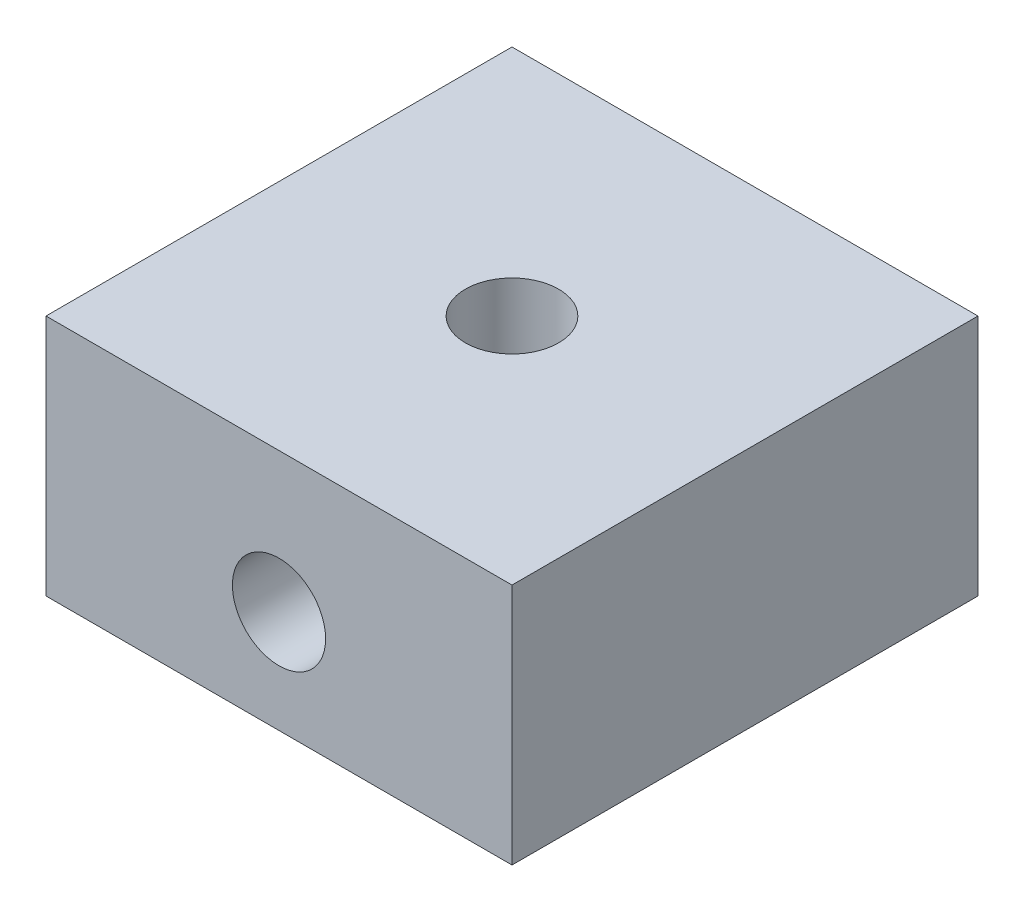
ISO-10303-21;
HEADER;
FILE_DESCRIPTION(('STEP AP214'),'2;1');
FILE_NAME('part.step','',(''),(''),'','','');
FILE_SCHEMA(('AUTOMOTIVE_DESIGN { 1 0 10303 214 1 1 1 1 }'));
ENDSEC;
DATA;
#1=APPLICATION_CONTEXT('core data for automotive mechanical design processes');
#2=APPLICATION_PROTOCOL_DEFINITION('international standard','automotive_design',2000,#1);
#3=PRODUCT_CONTEXT('',#1,'mechanical');
#4=PRODUCT('Part','Part','',(#3));
#5=PRODUCT_RELATED_PRODUCT_CATEGORY('part','',(#4));
#6=PRODUCT_DEFINITION_FORMATION('','',#4);
#7=PRODUCT_DEFINITION_CONTEXT('part definition',#1,'design');
#8=PRODUCT_DEFINITION('design','',#6,#7);
#9=PRODUCT_DEFINITION_SHAPE('','',#8);
#10=(LENGTH_UNIT() NAMED_UNIT(*) SI_UNIT(.MILLI.,.METRE.));
#11=(NAMED_UNIT(*) PLANE_ANGLE_UNIT() SI_UNIT($,.RADIAN.));
#12=(NAMED_UNIT(*) SI_UNIT($,.STERADIAN.) SOLID_ANGLE_UNIT());
#13=UNCERTAINTY_MEASURE_WITH_UNIT(LENGTH_MEASURE(1.E-05),#10,'distance_accuracy_value','');
#14=(GEOMETRIC_REPRESENTATION_CONTEXT(3) GLOBAL_UNCERTAINTY_ASSIGNED_CONTEXT((#13)) GLOBAL_UNIT_ASSIGNED_CONTEXT((#10,
#11,#12)) REPRESENTATION_CONTEXT('',''));
#15=CARTESIAN_POINT('',(0.,0.,0.));
#16=DIRECTION('',(0.,0.,1.));
#17=DIRECTION('',(1.,0.,0.));
#18=AXIS2_PLACEMENT_3D('',#15,#16,#17);
#19=CARTESIAN_POINT('',(0.,10.,0.));
#20=DIRECTION('',(-1.,0.,0.));
#21=DIRECTION('',(0.,1.,0.));
#22=AXIS2_PLACEMENT_3D('',#19,#20,#21);
#23=SPHERICAL_SURFACE('',#22,5.);
#24=CARTESIAN_POINT('',(0.,10.,0.));
#25=DIRECTION('',(0.,1.,0.));
#26=DIRECTION('',(0.,0.,1.));
#27=AXIS2_PLACEMENT_3D('',#24,#25,#26);
#28=CIRCLE('',#27,5.);
#29=CARTESIAN_POINT('',(5.,10.,0.));
#30=VERTEX_POINT('',#29);
#31=CARTESIAN_POINT('',(-5.,10.,0.));
#32=VERTEX_POINT('',#31);
#33=EDGE_CURVE('E87',#30,#32,#28,.T.);
#34=ORIENTED_EDGE('',*,*,#33,.T.);
#35=CARTESIAN_POINT('',(0.,10.,0.));
#36=DIRECTION('',(0.,0.,1.));
#37=DIRECTION('',(1.,0.,0.));
#38=AXIS2_PLACEMENT_3D('',#35,#36,#37);
#39=CIRCLE('',#38,5.);
#40=EDGE_CURVE('E11',#32,#30,#39,.T.);
#41=ORIENTED_EDGE('',*,*,#40,.T.);
#42=EDGE_LOOP('',(#34,#41));
#43=FACE_BOUND('',#42,.T.);
#44=ADVANCED_FACE('F37',(#43),#23,.F.);
#45=CARTESIAN_POINT('',(25.,-1.0186,-25.));
#46=DIRECTION('',(1.,0.,0.));
#47=DIRECTION('',(0.,0.,-1.));
#48=AXIS2_PLACEMENT_3D('',#45,#46,#47);
#49=PLANE('',#48);
#50=DIRECTION('',(0.,1.,0.));
#51=VECTOR('',#50,1.);
#52=CARTESIAN_POINT('',(25.,-1.0186,-25.));
#53=LINE('',#52,#51);
#54=CARTESIAN_POINT('',(25.,-1.0186,-25.));
#55=VERTEX_POINT('',#54);
#56=CARTESIAN_POINT('',(25.,25.,-25.));
#57=VERTEX_POINT('',#56);
#58=EDGE_CURVE('E119',#55,#57,#53,.T.);
#59=ORIENTED_EDGE('',*,*,#58,.T.);
#60=DIRECTION('',(0.,0.,-1.));
#61=VECTOR('',#60,1.);
#62=CARTESIAN_POINT('',(25.,25.,-25.));
#63=LINE('',#62,#61);
#64=CARTESIAN_POINT('',(25.,25.,25.));
#65=VERTEX_POINT('',#64);
#66=EDGE_CURVE('E91',#65,#57,#63,.T.);
#67=ORIENTED_EDGE('',*,*,#66,.F.);
#68=DIRECTION('',(0.,1.,0.));
#69=VECTOR('',#68,1.);
#70=CARTESIAN_POINT('',(25.,-1.0186,25.));
#71=LINE('',#70,#69);
#72=CARTESIAN_POINT('',(25.,-1.0186,25.));
#73=VERTEX_POINT('',#72);
#74=EDGE_CURVE('E45',#73,#65,#71,.T.);
#75=ORIENTED_EDGE('',*,*,#74,.F.);
#76=DIRECTION('',(0.,0.,-1.));
#77=VECTOR('',#76,1.);
#78=CARTESIAN_POINT('',(25.,-1.0186,-25.));
#79=LINE('',#78,#77);
#80=EDGE_CURVE('E108',#73,#55,#79,.T.);
#81=ORIENTED_EDGE('',*,*,#80,.T.);
#82=EDGE_LOOP('',(#59,#67,#75,#81));
#83=FACE_BOUND('',#82,.T.);
#84=ADVANCED_FACE('F39',(#83),#49,.T.);
#85=CARTESIAN_POINT('',(-25.,-1.0186,25.));
#86=DIRECTION('',(0.,0.,1.));
#87=DIRECTION('',(1.,0.,0.));
#88=AXIS2_PLACEMENT_3D('',#85,#86,#87);
#89=PLANE('',#88);
#90=CARTESIAN_POINT('',(0.,10.,25.));
#91=DIRECTION('',(0.,0.,1.));
#92=DIRECTION('',(1.,0.,0.));
#93=AXIS2_PLACEMENT_3D('',#90,#91,#92);
#94=CIRCLE('',#93,5.);
#95=CARTESIAN_POINT('',(5.,10.,25.));
#96=VERTEX_POINT('',#95);
#97=EDGE_CURVE('E89',#96,#96,#94,.T.);
#98=ORIENTED_EDGE('',*,*,#97,.F.);
#99=EDGE_LOOP('',(#98));
#100=FACE_BOUND('',#99,.T.);
#101=ORIENTED_EDGE('',*,*,#74,.T.);
#102=DIRECTION('',(1.,0.,0.));
#103=VECTOR('',#102,1.);
#104=CARTESIAN_POINT('',(-25.,25.,25.));
#105=LINE('',#104,#103);
#106=CARTESIAN_POINT('',(-25.,25.,25.));
#107=VERTEX_POINT('',#106);
#108=EDGE_CURVE('E105',#107,#65,#105,.T.);
#109=ORIENTED_EDGE('',*,*,#108,.F.);
#110=DIRECTION('',(0.,1.,0.));
#111=VECTOR('',#110,1.);
#112=CARTESIAN_POINT('',(-25.,-1.0186,25.));
#113=LINE('',#112,#111);
#114=CARTESIAN_POINT('',(-25.,-1.0186,25.));
#115=VERTEX_POINT('',#114);
#116=EDGE_CURVE('E121',#115,#107,#113,.T.);
#117=ORIENTED_EDGE('',*,*,#116,.F.);
#118=DIRECTION('',(1.,0.,0.));
#119=VECTOR('',#118,1.);
#120=CARTESIAN_POINT('',(-25.,-1.0186,25.));
#121=LINE('',#120,#119);
#122=EDGE_CURVE('E116',#115,#73,#121,.T.);
#123=ORIENTED_EDGE('',*,*,#122,.T.);
#124=EDGE_LOOP('',(#101,#109,#117,#123));
#125=FACE_BOUND('',#124,.T.);
#126=ADVANCED_FACE('F133',(#100,#125),#89,.T.);
#127=CARTESIAN_POINT('',(-25.,-1.0186,-25.));
#128=DIRECTION('',(-1.,0.,0.));
#129=DIRECTION('',(0.,0.,1.));
#130=AXIS2_PLACEMENT_3D('',#127,#128,#129);
#131=PLANE('',#130);
#132=ORIENTED_EDGE('',*,*,#116,.T.);
#133=DIRECTION('',(0.,0.,1.));
#134=VECTOR('',#133,1.);
#135=CARTESIAN_POINT('',(-25.,25.,-25.));
#136=LINE('',#135,#134);
#137=CARTESIAN_POINT('',(-25.,25.,-25.));
#138=VERTEX_POINT('',#137);
#139=EDGE_CURVE('E102',#138,#107,#136,.T.);
#140=ORIENTED_EDGE('',*,*,#139,.F.);
#141=DIRECTION('',(0.,1.,0.));
#142=VECTOR('',#141,1.);
#143=CARTESIAN_POINT('',(-25.,-1.0186,-25.));
#144=LINE('',#143,#142);
#145=CARTESIAN_POINT('',(-25.,-1.0186,-25.));
#146=VERTEX_POINT('',#145);
#147=EDGE_CURVE('E123',#146,#138,#144,.T.);
#148=ORIENTED_EDGE('',*,*,#147,.F.);
#149=DIRECTION('',(0.,0.,1.));
#150=VECTOR('',#149,1.);
#151=CARTESIAN_POINT('',(-25.,-1.0186,-25.));
#152=LINE('',#151,#150);
#153=EDGE_CURVE('E113',#146,#115,#152,.T.);
#154=ORIENTED_EDGE('',*,*,#153,.T.);
#155=EDGE_LOOP('',(#132,#140,#148,#154));
#156=FACE_BOUND('',#155,.T.);
#157=ADVANCED_FACE('F139',(#156),#131,.T.);
#158=CARTESIAN_POINT('',(-25.,-1.0186,-25.));
#159=DIRECTION('',(0.,0.,-1.));
#160=DIRECTION('',(-1.,0.,0.));
#161=AXIS2_PLACEMENT_3D('',#158,#159,#160);
#162=PLANE('',#161);
#163=ORIENTED_EDGE('',*,*,#147,.T.);
#164=DIRECTION('',(-1.,0.,0.));
#165=VECTOR('',#164,1.);
#166=CARTESIAN_POINT('',(-25.,25.,-25.));
#167=LINE('',#166,#165);
#168=EDGE_CURVE('E94',#57,#138,#167,.T.);
#169=ORIENTED_EDGE('',*,*,#168,.F.);
#170=ORIENTED_EDGE('',*,*,#58,.F.);
#171=DIRECTION('',(-1.,0.,0.));
#172=VECTOR('',#171,1.);
#173=CARTESIAN_POINT('',(-25.,-1.0186,-25.));
#174=LINE('',#173,#172);
#175=EDGE_CURVE('E110',#55,#146,#174,.T.);
#176=ORIENTED_EDGE('',*,*,#175,.T.);
#177=EDGE_LOOP('',(#163,#169,#170,#176));
#178=FACE_BOUND('',#177,.T.);
#179=ADVANCED_FACE('F127',(#178),#162,.T.);
#180=CARTESIAN_POINT('',(0.,-1.0186,0.));
#181=DIRECTION('',(0.,1.,0.));
#182=DIRECTION('',(0.,0.,1.));
#183=AXIS2_PLACEMENT_3D('',#180,#181,#182);
#184=PLANE('',#183);
#185=ORIENTED_EDGE('',*,*,#80,.F.);
#186=ORIENTED_EDGE('',*,*,#122,.F.);
#187=ORIENTED_EDGE('',*,*,#153,.F.);
#188=ORIENTED_EDGE('',*,*,#175,.F.);
#189=EDGE_LOOP('',(#185,#186,#187,#188));
#190=FACE_BOUND('',#189,.T.);
#191=ADVANCED_FACE('F137',(#190),#184,.F.);
#192=CARTESIAN_POINT('',(0.,25.,0.));
#193=DIRECTION('',(0.,1.,0.));
#194=DIRECTION('',(0.,0.,1.));
#195=AXIS2_PLACEMENT_3D('',#192,#193,#194);
#196=PLANE('',#195);
#197=CARTESIAN_POINT('',(0.,25.,0.));
#198=DIRECTION('',(0.,1.,0.));
#199=DIRECTION('',(0.,0.,1.));
#200=AXIS2_PLACEMENT_3D('',#197,#198,#199);
#201=CIRCLE('',#200,5.);
#202=CARTESIAN_POINT('',(0.,25.,5.));
#203=VERTEX_POINT('',#202);
#204=EDGE_CURVE('E88',#203,#203,#201,.T.);
#205=ORIENTED_EDGE('',*,*,#204,.F.);
#206=EDGE_LOOP('',(#205));
#207=FACE_BOUND('',#206,.T.);
#208=ORIENTED_EDGE('',*,*,#66,.T.);
#209=ORIENTED_EDGE('',*,*,#168,.T.);
#210=ORIENTED_EDGE('',*,*,#139,.T.);
#211=ORIENTED_EDGE('',*,*,#108,.T.);
#212=EDGE_LOOP('',(#208,#209,#210,#211));
#213=FACE_BOUND('',#212,.T.);
#214=ADVANCED_FACE('F130',(#207,#213),#196,.T.);
#215=CARTESIAN_POINT('',(0.,10.,0.));
#216=DIRECTION('',(0.,1.,0.));
#217=DIRECTION('',(0.,0.,1.));
#218=AXIS2_PLACEMENT_3D('',#215,#216,#217);
#219=CYLINDRICAL_SURFACE('',#218,5.);
#220=ORIENTED_EDGE('',*,*,#33,.F.);
#221=CARTESIAN_POINT('',(0.,10.,0.));
#222=DIRECTION('',(0.,0.707106781186547,-0.707106781186547));
#223=DIRECTION('',(0.,0.707106781186547,0.707106781186547));
#224=AXIS2_PLACEMENT_3D('',#221,#222,#223);
#225=ELLIPSE('',#224,7.07106781186548,5.);
#226=EDGE_CURVE('E51',#30,#32,#225,.F.);
#227=ORIENTED_EDGE('',*,*,#226,.T.);
#228=EDGE_LOOP('',(#220,#227));
#229=FACE_BOUND('',#228,.T.);
#230=ORIENTED_EDGE('',*,*,#204,.T.);
#231=EDGE_LOOP('',(#230));
#232=FACE_BOUND('',#231,.T.);
#233=ADVANCED_FACE('F85',(#229,#232),#219,.F.);
#234=CARTESIAN_POINT('',(0.,10.,0.));
#235=DIRECTION('',(0.,0.,1.));
#236=DIRECTION('',(1.,0.,0.));
#237=AXIS2_PLACEMENT_3D('',#234,#235,#236);
#238=CYLINDRICAL_SURFACE('',#237,5.);
#239=ORIENTED_EDGE('',*,*,#97,.T.);
#240=EDGE_LOOP('',(#239));
#241=FACE_BOUND('',#240,.T.);
#242=ORIENTED_EDGE('',*,*,#40,.F.);
#243=ORIENTED_EDGE('',*,*,#226,.F.);
#244=EDGE_LOOP('',(#242,#243));
#245=FACE_BOUND('',#244,.T.);
#246=ADVANCED_FACE('F80',(#241,#245),#238,.F.);
#247=CLOSED_SHELL('',(#44,#84,#126,#157,#179,#191,#214,#233,#246));
#248=MANIFOLD_SOLID_BREP('B2',#247);
#249=ADVANCED_BREP_SHAPE_REPRESENTATION('',(#18,#248),#14);
#250=SHAPE_DEFINITION_REPRESENTATION(#9,#249);
ENDSEC;
END-ISO-10303-21;
